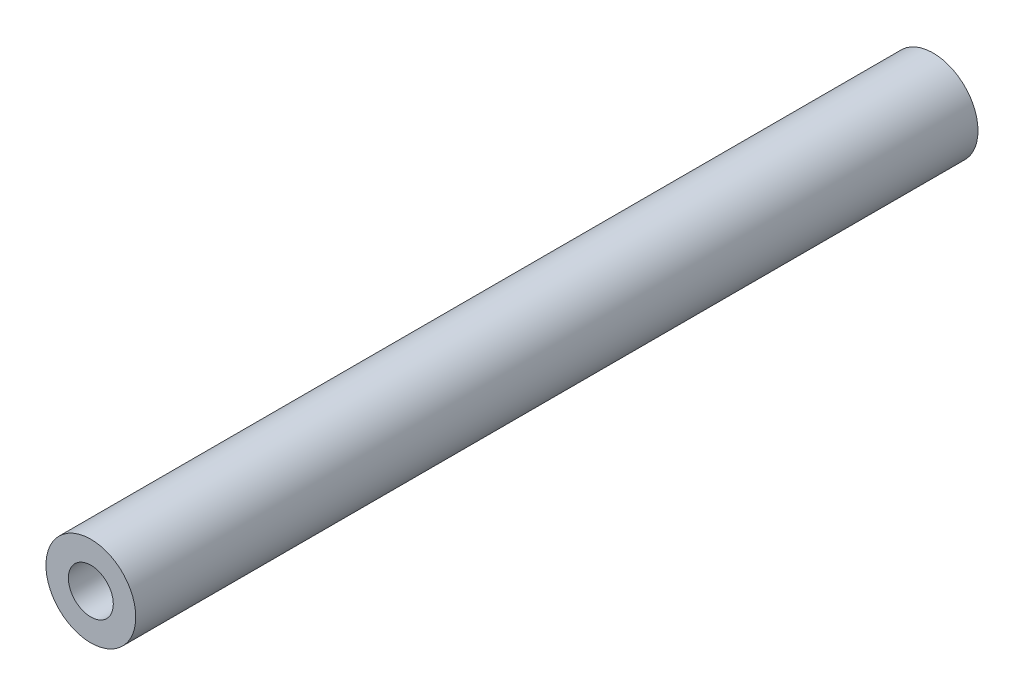
ISO-10303-21;
HEADER;
FILE_DESCRIPTION(('STEP AP214'),'2;1');
FILE_NAME('part.step','',(''),(''),'','','');
FILE_SCHEMA(('AUTOMOTIVE_DESIGN { 1 0 10303 214 1 1 1 1 }'));
ENDSEC;
DATA;
#1=APPLICATION_CONTEXT('core data for automotive mechanical design processes');
#2=APPLICATION_PROTOCOL_DEFINITION('international standard','automotive_design',2000,#1);
#3=PRODUCT_CONTEXT('',#1,'mechanical');
#4=PRODUCT('Part','Part','',(#3));
#5=PRODUCT_RELATED_PRODUCT_CATEGORY('part','',(#4));
#6=PRODUCT_DEFINITION_FORMATION('','',#4);
#7=PRODUCT_DEFINITION_CONTEXT('part definition',#1,'design');
#8=PRODUCT_DEFINITION('design','',#6,#7);
#9=PRODUCT_DEFINITION_SHAPE('','',#8);
#10=(LENGTH_UNIT() NAMED_UNIT(*) SI_UNIT(.MILLI.,.METRE.));
#11=(NAMED_UNIT(*) PLANE_ANGLE_UNIT() SI_UNIT($,.RADIAN.));
#12=(NAMED_UNIT(*) SI_UNIT($,.STERADIAN.) SOLID_ANGLE_UNIT());
#13=UNCERTAINTY_MEASURE_WITH_UNIT(LENGTH_MEASURE(1.E-05),#10,'distance_accuracy_value','');
#14=(GEOMETRIC_REPRESENTATION_CONTEXT(3) GLOBAL_UNCERTAINTY_ASSIGNED_CONTEXT((#13)) GLOBAL_UNIT_ASSIGNED_CONTEXT((#10,
#11,#12)) REPRESENTATION_CONTEXT('',''));
#15=CARTESIAN_POINT('',(0.,0.,0.));
#16=DIRECTION('',(0.,0.,1.));
#17=DIRECTION('',(1.,0.,0.));
#18=AXIS2_PLACEMENT_3D('',#15,#16,#17);
#19=CARTESIAN_POINT('',(0.,0.,37.5));
#20=DIRECTION('',(0.,0.,-1.));
#21=DIRECTION('',(-1.,0.,0.));
#22=AXIS2_PLACEMENT_3D('',#19,#20,#21);
#23=CYLINDRICAL_SURFACE('',#22,4.);
#24=CARTESIAN_POINT('',(0.,0.,37.5));
#25=DIRECTION('',(0.,0.,1.));
#26=DIRECTION('',(1.,0.,0.));
#27=AXIS2_PLACEMENT_3D('',#24,#25,#26);
#28=CIRCLE('',#27,4.);
#29=CARTESIAN_POINT('',(4.,0.,37.5));
#30=VERTEX_POINT('',#29);
#31=EDGE_CURVE('E10',#30,#30,#28,.T.);
#32=ORIENTED_EDGE('',*,*,#31,.F.);
#33=EDGE_LOOP('',(#32));
#34=FACE_BOUND('',#33,.T.);
#35=CARTESIAN_POINT('',(0.,0.,-37.5));
#36=DIRECTION('',(0.,0.,1.));
#37=DIRECTION('',(1.,0.,0.));
#38=AXIS2_PLACEMENT_3D('',#35,#36,#37);
#39=CIRCLE('',#38,4.);
#40=CARTESIAN_POINT('',(4.,0.,-37.5));
#41=VERTEX_POINT('',#40);
#42=EDGE_CURVE('E34',#41,#41,#39,.T.);
#43=ORIENTED_EDGE('',*,*,#42,.T.);
#44=EDGE_LOOP('',(#43));
#45=FACE_BOUND('',#44,.T.);
#46=ADVANCED_FACE('F31',(#34,#45),#23,.T.);
#47=CARTESIAN_POINT('',(0.,0.,37.5));
#48=DIRECTION('',(0.,0.,1.));
#49=DIRECTION('',(1.,0.,0.));
#50=AXIS2_PLACEMENT_3D('',#47,#48,#49);
#51=PLANE('',#50);
#52=CARTESIAN_POINT('',(0.,0.,37.5));
#53=DIRECTION('',(0.,0.,1.));
#54=DIRECTION('',(1.,0.,0.));
#55=AXIS2_PLACEMENT_3D('',#52,#53,#54);
#56=CIRCLE('',#55,2.);
#57=CARTESIAN_POINT('',(2.,0.,37.5));
#58=VERTEX_POINT('',#57);
#59=EDGE_CURVE('E43',#58,#58,#56,.T.);
#60=ORIENTED_EDGE('',*,*,#59,.F.);
#61=EDGE_LOOP('',(#60));
#62=FACE_BOUND('',#61,.T.);
#63=ORIENTED_EDGE('',*,*,#31,.T.);
#64=EDGE_LOOP('',(#63));
#65=FACE_BOUND('',#64,.T.);
#66=ADVANCED_FACE('F67',(#62,#65),#51,.T.);
#67=CARTESIAN_POINT('',(0.,0.,-37.5));
#68=DIRECTION('',(0.,0.,1.));
#69=DIRECTION('',(1.,0.,0.));
#70=AXIS2_PLACEMENT_3D('',#67,#68,#69);
#71=PLANE('',#70);
#72=CARTESIAN_POINT('',(0.,0.,-37.5));
#73=DIRECTION('',(0.,0.,1.));
#74=DIRECTION('',(1.,0.,0.));
#75=AXIS2_PLACEMENT_3D('',#72,#73,#74);
#76=CIRCLE('',#75,2.);
#77=CARTESIAN_POINT('',(2.,0.,-37.5));
#78=VERTEX_POINT('',#77);
#79=EDGE_CURVE('E49',#78,#78,#76,.T.);
#80=ORIENTED_EDGE('',*,*,#79,.T.);
#81=EDGE_LOOP('',(#80));
#82=FACE_BOUND('',#81,.T.);
#83=ORIENTED_EDGE('',*,*,#42,.F.);
#84=EDGE_LOOP('',(#83));
#85=FACE_BOUND('',#84,.T.);
#86=ADVANCED_FACE('F72',(#82,#85),#71,.F.);
#87=CARTESIAN_POINT('',(0.,0.,33.5));
#88=DIRECTION('',(0.,0.,1.));
#89=DIRECTION('',(1.,0.,0.));
#90=AXIS2_PLACEMENT_3D('',#87,#88,#89);
#91=CYLINDRICAL_SURFACE('',#90,2.);
#92=CARTESIAN_POINT('',(0.,0.,33.5));
#93=DIRECTION('',(0.,0.,1.));
#94=DIRECTION('',(1.,0.,0.));
#95=AXIS2_PLACEMENT_3D('',#92,#93,#94);
#96=CIRCLE('',#95,2.);
#97=CARTESIAN_POINT('',(2.,0.,33.5));
#98=VERTEX_POINT('',#97);
#99=EDGE_CURVE('E41',#98,#98,#96,.T.);
#100=ORIENTED_EDGE('',*,*,#99,.F.);
#101=EDGE_LOOP('',(#100));
#102=FACE_BOUND('',#101,.T.);
#103=ORIENTED_EDGE('',*,*,#59,.T.);
#104=EDGE_LOOP('',(#103));
#105=FACE_BOUND('',#104,.T.);
#106=ADVANCED_FACE('F79',(#102,#105),#91,.F.);
#107=CARTESIAN_POINT('',(0.,0.,33.5));
#108=DIRECTION('',(0.,0.,1.));
#109=DIRECTION('',(1.,0.,0.));
#110=AXIS2_PLACEMENT_3D('',#107,#108,#109);
#111=PLANE('',#110);
#112=ORIENTED_EDGE('',*,*,#99,.T.);
#113=EDGE_LOOP('',(#112));
#114=FACE_BOUND('',#113,.T.);
#115=ADVANCED_FACE('F64',(#114),#111,.T.);
#116=CARTESIAN_POINT('',(0.,0.,-33.5));
#117=DIRECTION('',(0.,0.,-1.));
#118=DIRECTION('',(-1.,0.,0.));
#119=AXIS2_PLACEMENT_3D('',#116,#117,#118);
#120=CYLINDRICAL_SURFACE('',#119,2.);
#121=CARTESIAN_POINT('',(0.,0.,-33.5));
#122=DIRECTION('',(0.,0.,1.));
#123=DIRECTION('',(1.,0.,0.));
#124=AXIS2_PLACEMENT_3D('',#121,#122,#123);
#125=CIRCLE('',#124,2.);
#126=CARTESIAN_POINT('',(2.,0.,-33.5));
#127=VERTEX_POINT('',#126);
#128=EDGE_CURVE('E46',#127,#127,#125,.T.);
#129=ORIENTED_EDGE('',*,*,#128,.T.);
#130=EDGE_LOOP('',(#129));
#131=FACE_BOUND('',#130,.T.);
#132=ORIENTED_EDGE('',*,*,#79,.F.);
#133=EDGE_LOOP('',(#132));
#134=FACE_BOUND('',#133,.T.);
#135=ADVANCED_FACE('F55',(#131,#134),#120,.F.);
#136=CARTESIAN_POINT('',(0.,0.,-33.5));
#137=DIRECTION('',(0.,0.,-1.));
#138=DIRECTION('',(1.,0.,0.));
#139=AXIS2_PLACEMENT_3D('',#136,#137,#138);
#140=PLANE('',#139);
#141=ORIENTED_EDGE('',*,*,#128,.F.);
#142=EDGE_LOOP('',(#141));
#143=FACE_BOUND('',#142,.T.);
#144=ADVANCED_FACE('F58',(#143),#140,.T.);
#145=CLOSED_SHELL('',(#46,#66,#86,#106,#115,#135,#144));
#146=MANIFOLD_SOLID_BREP('B2',#145);
#147=ADVANCED_BREP_SHAPE_REPRESENTATION('',(#18,#146),#14);
#148=SHAPE_DEFINITION_REPRESENTATION(#9,#147);
ENDSEC;
END-ISO-10303-21;
